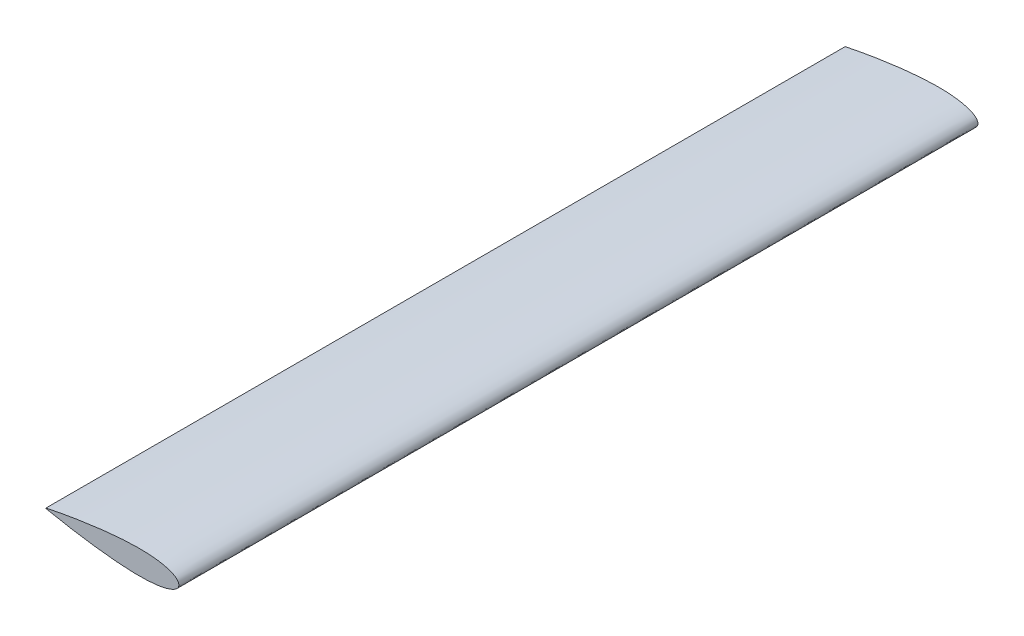
ISO-10303-21;
HEADER;
FILE_DESCRIPTION(('STEP AP214'),'2;1');
FILE_NAME('part.step','',(''),(''),'','','');
FILE_SCHEMA(('AUTOMOTIVE_DESIGN { 1 0 10303 214 1 1 1 1 }'));
ENDSEC;
DATA;
#1=APPLICATION_CONTEXT('core data for automotive mechanical design processes');
#2=APPLICATION_PROTOCOL_DEFINITION('international standard','automotive_design',2000,#1);
#3=PRODUCT_CONTEXT('',#1,'mechanical');
#4=PRODUCT('Part','Part','',(#3));
#5=PRODUCT_RELATED_PRODUCT_CATEGORY('part','',(#4));
#6=PRODUCT_DEFINITION_FORMATION('','',#4);
#7=PRODUCT_DEFINITION_CONTEXT('part definition',#1,'design');
#8=PRODUCT_DEFINITION('design','',#6,#7);
#9=PRODUCT_DEFINITION_SHAPE('','',#8);
#10=(LENGTH_UNIT() NAMED_UNIT(*) SI_UNIT(.MILLI.,.METRE.));
#11=(NAMED_UNIT(*) PLANE_ANGLE_UNIT() SI_UNIT($,.RADIAN.));
#12=(NAMED_UNIT(*) SI_UNIT($,.STERADIAN.) SOLID_ANGLE_UNIT());
#13=UNCERTAINTY_MEASURE_WITH_UNIT(LENGTH_MEASURE(1.E-05),#10,'distance_accuracy_value','');
#14=(GEOMETRIC_REPRESENTATION_CONTEXT(3) GLOBAL_UNCERTAINTY_ASSIGNED_CONTEXT((#13)) GLOBAL_UNIT_ASSIGNED_CONTEXT((#10,
#11,#12)) REPRESENTATION_CONTEXT('',''));
#15=CARTESIAN_POINT('',(0.,0.,0.));
#16=DIRECTION('',(0.,0.,1.));
#17=DIRECTION('',(1.,0.,0.));
#18=AXIS2_PLACEMENT_3D('',#15,#16,#17);
#19=CARTESIAN_POINT('',(-265.999999999999,-0.503000000467428,800.));
#20=CARTESIAN_POINT('',(-261.568824613127,-1.41910493794682,800.));
#21=CARTESIAN_POINT('',(-252.716442874089,-3.24925380626102,800.));
#22=CARTESIAN_POINT('',(-234.995464142612,-6.64481991794921,800.));
#23=CARTESIAN_POINT('',(-212.843288824471,-10.5485288362705,800.));
#24=CARTESIAN_POINT('',(-186.239809232107,-14.7042798016418,800.));
#25=CARTESIAN_POINT('',(-159.640651569451,-18.3128469708548,800.));
#26=CARTESIAN_POINT('',(-133.040852361654,-21.2623525177975,800.));
#27=CARTESIAN_POINT('',(-106.434765804828,-23.3530401063583,800.));
#28=CARTESIAN_POINT('',(-84.236960535237,-24.0962408200567,800.));
#29=CARTESIAN_POINT('',(-66.4892669119629,-23.7998937302964,800.));
#30=CARTESIAN_POINT('',(-53.1677388629969,-23.0109475445305,800.));
#31=CARTESIAN_POINT('',(-39.8211485531244,-21.4880571787925,800.));
#32=CARTESIAN_POINT('',(-28.7128335803096,-19.3599045445356,800.));
#33=CARTESIAN_POINT('',(-19.8529586715222,-16.8284915630262,800.));
#34=CARTESIAN_POINT('',(-13.0873654133834,-14.2708296517311,800.));
#35=CARTESIAN_POINT('',(-7.41956020196074,-11.1922678624387,800.));
#36=CARTESIAN_POINT('',(-2.20731315294942,-6.93210672242582,800.));
#37=CARTESIAN_POINT('',(1.44035156805781,2.05190266769401E-10,800.));
#38=CARTESIAN_POINT('',(-2.20731315298429,6.9321067228178,800.));
#39=CARTESIAN_POINT('',(-7.41956020201701,11.1922678628044,800.));
#40=CARTESIAN_POINT('',(-13.0873654134552,14.2708296520684,800.));
#41=CARTESIAN_POINT('',(-19.8529586716068,16.8284915633294,800.));
#42=CARTESIAN_POINT('',(-28.712833580407,19.3599045447942,800.));
#43=CARTESIAN_POINT('',(-39.8211485532324,21.4880571789953,800.));
#44=CARTESIAN_POINT('',(-53.1677388631127,23.0109475446662,800.));
#45=CARTESIAN_POINT('',(-66.4892669120825,23.799893730365,800.));
#46=CARTESIAN_POINT('',(-84.2369605353583,24.0962408200361,800.));
#47=CARTESIAN_POINT('',(-106.434765804945,23.353040106226,800.));
#48=CARTESIAN_POINT('',(-133.040852361761,21.2623525175314,800.));
#49=CARTESIAN_POINT('',(-159.640651569543,18.3128469704549,800.));
#50=CARTESIAN_POINT('',(-186.239809232181,14.7042798011081,800.));
#51=CARTESIAN_POINT('',(-212.843288824524,10.548528835603,800.));
#52=CARTESIAN_POINT('',(-234.995464142645,6.6448199171703,800.));
#53=CARTESIAN_POINT('',(-252.716442874106,3.24925380539299,800.));
#54=CARTESIAN_POINT('',(-261.568824613134,1.41910493703425,800.));
#55=CARTESIAN_POINT('',(-266.000000000001,0.502999999532572,800.));
#56=B_SPLINE_CURVE_WITH_KNOTS('',3,(#19,#20,#21,#22,#23,#24,#25,#26,#27,#28,#29,#30,#31,#32,#33,
#34,#35,#36,#37,#38,#39,#40,#41,#42,#43,#44,#45,#46,#47,#48,#49,#50,#51,#52,#53,#54,#55),
.UNSPECIFIED.,.F.,.F.,(4,1,1,1,1,1,1,1,1,1,1,1,1,1,1,1,1,1,1,1,1,1,1,1,1,1,1,1,1,1,1,1,1,1,4),
(0.,0.0246038933451094,0.0491524340929429,0.0981085566584546,0.146905125159748,
0.195554766723559,0.244056172228335,0.2924094136053,0.340643604803074,0.364753980610275,
0.388905472973926,0.413177962040512,0.437756077223996,0.45030461507737,0.463229874886268,
0.477067413917468,0.485035659177221,0.5,0.514964340822779,0.522932586082532,0.536770125113732,
0.54969538492263,0.562243922776004,0.586822037959488,0.611094527026074,0.635246019389725,
0.659356395196926,0.7075905863947,0.755943827771665,0.804445233276441,0.853094874840252,
0.901891443341545,0.950847565907057,0.975396106654891,1.),.UNSPECIFIED.);
#57=DIRECTION('',(0.,0.,-1.));
#58=VECTOR('',#57,1.);
#59=SURFACE_OF_LINEAR_EXTRUSION('',#56,#58);
#60=CARTESIAN_POINT('',(-265.999999999999,-0.503000000467428,-800.));
#61=CARTESIAN_POINT('',(-261.568824613127,-1.41910493794682,-800.));
#62=CARTESIAN_POINT('',(-252.716442874089,-3.24925380626102,-800.));
#63=CARTESIAN_POINT('',(-234.995464142612,-6.64481991794921,-800.));
#64=CARTESIAN_POINT('',(-212.843288824471,-10.5485288362705,-800.));
#65=CARTESIAN_POINT('',(-186.239809232107,-14.7042798016418,-800.));
#66=CARTESIAN_POINT('',(-159.640651569451,-18.3128469708548,-800.));
#67=CARTESIAN_POINT('',(-133.040852361654,-21.2623525177975,-800.));
#68=CARTESIAN_POINT('',(-106.434765804828,-23.3530401063583,-800.));
#69=CARTESIAN_POINT('',(-84.236960535237,-24.0962408200567,-800.));
#70=CARTESIAN_POINT('',(-66.4892669119629,-23.7998937302964,-800.));
#71=CARTESIAN_POINT('',(-53.1677388629969,-23.0109475445305,-800.));
#72=CARTESIAN_POINT('',(-39.8211485531244,-21.4880571787925,-800.));
#73=CARTESIAN_POINT('',(-28.7128335803096,-19.3599045445356,-800.));
#74=CARTESIAN_POINT('',(-19.8529586715222,-16.8284915630262,-800.));
#75=CARTESIAN_POINT('',(-13.0873654133834,-14.2708296517311,-800.));
#76=CARTESIAN_POINT('',(-7.41956020196074,-11.1922678624387,-800.));
#77=CARTESIAN_POINT('',(-2.20731315294942,-6.93210672242582,-800.));
#78=CARTESIAN_POINT('',(1.44035156805781,2.05190266769401E-10,-800.));
#79=CARTESIAN_POINT('',(-2.20731315298429,6.9321067228178,-800.));
#80=CARTESIAN_POINT('',(-7.41956020201701,11.1922678628044,-800.));
#81=CARTESIAN_POINT('',(-13.0873654134552,14.2708296520684,-800.));
#82=CARTESIAN_POINT('',(-19.8529586716068,16.8284915633294,-800.));
#83=CARTESIAN_POINT('',(-28.712833580407,19.3599045447942,-800.));
#84=CARTESIAN_POINT('',(-39.8211485532324,21.4880571789953,-800.));
#85=CARTESIAN_POINT('',(-53.1677388631127,23.0109475446662,-800.));
#86=CARTESIAN_POINT('',(-66.4892669120825,23.799893730365,-800.));
#87=CARTESIAN_POINT('',(-84.2369605353583,24.0962408200361,-800.));
#88=CARTESIAN_POINT('',(-106.434765804945,23.353040106226,-800.));
#89=CARTESIAN_POINT('',(-133.040852361761,21.2623525175314,-800.));
#90=CARTESIAN_POINT('',(-159.640651569543,18.3128469704549,-800.));
#91=CARTESIAN_POINT('',(-186.239809232181,14.7042798011081,-800.));
#92=CARTESIAN_POINT('',(-212.843288824524,10.548528835603,-800.));
#93=CARTESIAN_POINT('',(-234.995464142645,6.6448199171703,-800.));
#94=CARTESIAN_POINT('',(-252.716442874106,3.24925380539299,-800.));
#95=CARTESIAN_POINT('',(-261.568824613134,1.41910493703425,-800.));
#96=CARTESIAN_POINT('',(-266.000000000001,0.502999999532572,-800.));
#97=B_SPLINE_CURVE_WITH_KNOTS('',3,(#60,#61,#62,#63,#64,#65,#66,#67,#68,#69,#70,#71,#72,#73,#74,
#75,#76,#77,#78,#79,#80,#81,#82,#83,#84,#85,#86,#87,#88,#89,#90,#91,#92,#93,#94,#95,#96),
.UNSPECIFIED.,.F.,.F.,(4,1,1,1,1,1,1,1,1,1,1,1,1,1,1,1,1,1,1,1,1,1,1,1,1,1,1,1,1,1,1,1,1,1,4),
(0.,0.0246038933451094,0.0491524340929429,0.0981085566584546,0.146905125159748,
0.195554766723559,0.244056172228335,0.2924094136053,0.340643604803074,0.364753980610275,
0.388905472973926,0.413177962040512,0.437756077223996,0.45030461507737,0.463229874886268,
0.477067413917468,0.485035659177221,0.5,0.514964340822779,0.522932586082532,0.536770125113732,
0.54969538492263,0.562243922776004,0.586822037959488,0.611094527026074,0.635246019389725,
0.659356395196926,0.7075905863947,0.755943827771665,0.804445233276441,0.853094874840252,
0.901891443341545,0.950847565907057,0.975396106654891,1.),.UNSPECIFIED.);
#98=CARTESIAN_POINT('',(-265.999999999999,-0.503000000467428,-800.));
#99=VERTEX_POINT('',#98);
#100=CARTESIAN_POINT('',(-266.000000000001,0.502999999532572,-800.));
#101=VERTEX_POINT('',#100);
#102=EDGE_CURVE('E71',#99,#101,#97,.T.);
#103=ORIENTED_EDGE('',*,*,#102,.T.);
#104=DIRECTION('',(0.,0.,-1.));
#105=VECTOR('',#104,1.);
#106=CARTESIAN_POINT('',(-266.000000000001,0.502999999532572,800.));
#107=LINE('',#106,#105);
#108=CARTESIAN_POINT('',(-266.000000000001,0.502999999532572,800.));
#109=VERTEX_POINT('',#108);
#110=EDGE_CURVE('E11',#109,#101,#107,.T.);
#111=ORIENTED_EDGE('',*,*,#110,.F.);
#112=CARTESIAN_POINT('',(-265.999999999999,-0.503000000467428,800.));
#113=VERTEX_POINT('',#112);
#114=EDGE_CURVE('E70',#113,#109,#56,.T.);
#115=ORIENTED_EDGE('',*,*,#114,.F.);
#116=DIRECTION('',(0.,0.,-1.));
#117=VECTOR('',#116,1.);
#118=CARTESIAN_POINT('',(-265.999999999999,-0.503000000467428,800.));
#119=LINE('',#118,#117);
#120=EDGE_CURVE('E48',#113,#99,#119,.T.);
#121=ORIENTED_EDGE('',*,*,#120,.T.);
#122=EDGE_LOOP('',(#103,#111,#115,#121));
#123=FACE_BOUND('',#122,.T.);
#124=ADVANCED_FACE('F39',(#123),#59,.F.);
#125=CARTESIAN_POINT('',(-265.999999999999,-0.503000000467428,800.));
#126=DIRECTION('',(1.,2.42792311548245E-12,0.));
#127=DIRECTION('',(-2.42792311548245E-12,1.,0.));
#128=AXIS2_PLACEMENT_3D('',#125,#126,#127);
#129=PLANE('',#128);
#130=DIRECTION('',(2.42792311548245E-12,-1.,0.));
#131=VECTOR('',#130,1.);
#132=CARTESIAN_POINT('',(-265.999999999999,-0.503000000467428,-800.));
#133=LINE('',#132,#131);
#134=EDGE_CURVE('E63',#101,#99,#133,.T.);
#135=ORIENTED_EDGE('',*,*,#134,.T.);
#136=ORIENTED_EDGE('',*,*,#120,.F.);
#137=DIRECTION('',(2.42792311548245E-12,-1.,0.));
#138=VECTOR('',#137,1.);
#139=CARTESIAN_POINT('',(-265.999999999999,-0.503000000467428,800.));
#140=LINE('',#139,#138);
#141=EDGE_CURVE('E55',#109,#113,#140,.T.);
#142=ORIENTED_EDGE('',*,*,#141,.F.);
#143=ORIENTED_EDGE('',*,*,#110,.T.);
#144=EDGE_LOOP('',(#135,#136,#142,#143));
#145=FACE_BOUND('',#144,.T.);
#146=ADVANCED_FACE('F66',(#145),#129,.F.);
#147=CARTESIAN_POINT('',(-1.10913882245255E-13,2.01548413375496E-10,800.));
#148=DIRECTION('',(0.,0.,1.));
#149=DIRECTION('',(1.,0.,0.));
#150=AXIS2_PLACEMENT_3D('',#147,#148,#149);
#151=PLANE('',#150);
#152=ORIENTED_EDGE('',*,*,#114,.T.);
#153=ORIENTED_EDGE('',*,*,#141,.T.);
#154=EDGE_LOOP('',(#152,#153));
#155=FACE_BOUND('',#154,.T.);
#156=ADVANCED_FACE('F88',(#155),#151,.T.);
#157=CARTESIAN_POINT('',(-1.10913882245255E-13,2.01548413375496E-10,-800.));
#158=DIRECTION('',(0.,0.,1.));
#159=DIRECTION('',(1.,0.,0.));
#160=AXIS2_PLACEMENT_3D('',#157,#158,#159);
#161=PLANE('',#160);
#162=ORIENTED_EDGE('',*,*,#102,.F.);
#163=ORIENTED_EDGE('',*,*,#134,.F.);
#164=EDGE_LOOP('',(#162,#163));
#165=FACE_BOUND('',#164,.T.);
#166=ADVANCED_FACE('F74',(#165),#161,.F.);
#167=CLOSED_SHELL('',(#124,#146,#156,#166));
#168=MANIFOLD_SOLID_BREP('B2',#167);
#169=ADVANCED_BREP_SHAPE_REPRESENTATION('',(#18,#168),#14);
#170=SHAPE_DEFINITION_REPRESENTATION(#9,#169);
ENDSEC;
END-ISO-10303-21;
